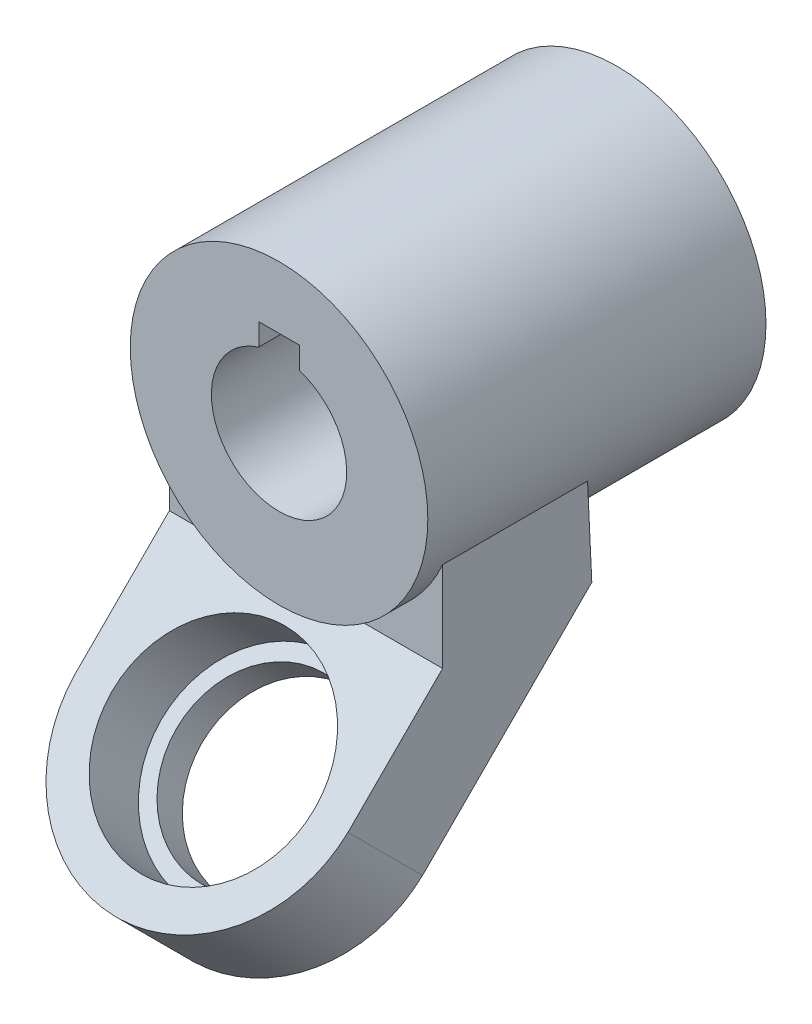
ISO-10303-21;
HEADER;
FILE_DESCRIPTION(('STEP AP214'),'2;1');
FILE_NAME('part.step','',(''),(''),'','','');
FILE_SCHEMA(('AUTOMOTIVE_DESIGN { 1 0 10303 214 1 1 1 1 }'));
ENDSEC;
DATA;
#1=APPLICATION_CONTEXT('core data for automotive mechanical design processes');
#2=APPLICATION_PROTOCOL_DEFINITION('international standard','automotive_design',2000,#1);
#3=PRODUCT_CONTEXT('',#1,'mechanical');
#4=PRODUCT('Part','Part','',(#3));
#5=PRODUCT_RELATED_PRODUCT_CATEGORY('part','',(#4));
#6=PRODUCT_DEFINITION_FORMATION('','',#4);
#7=PRODUCT_DEFINITION_CONTEXT('part definition',#1,'design');
#8=PRODUCT_DEFINITION('design','',#6,#7);
#9=PRODUCT_DEFINITION_SHAPE('','',#8);
#10=(LENGTH_UNIT() NAMED_UNIT(*) SI_UNIT(.MILLI.,.METRE.));
#11=(NAMED_UNIT(*) PLANE_ANGLE_UNIT() SI_UNIT($,.RADIAN.));
#12=(NAMED_UNIT(*) SI_UNIT($,.STERADIAN.) SOLID_ANGLE_UNIT());
#13=UNCERTAINTY_MEASURE_WITH_UNIT(LENGTH_MEASURE(1.E-05),#10,'distance_accuracy_value','');
#14=(GEOMETRIC_REPRESENTATION_CONTEXT(3) GLOBAL_UNCERTAINTY_ASSIGNED_CONTEXT((#13)) GLOBAL_UNIT_ASSIGNED_CONTEXT((#10,
#11,#12)) REPRESENTATION_CONTEXT('',''));
#15=CARTESIAN_POINT('',(0.,0.,0.));
#16=DIRECTION('',(0.,0.,1.));
#17=DIRECTION('',(1.,0.,0.));
#18=AXIS2_PLACEMENT_3D('',#15,#16,#17);
#19=CARTESIAN_POINT('',(-20.2,-49.9834703247907,49.0000000000002));
#20=DIRECTION('',(0.,0.707106781186549,0.707106781186546));
#21=DIRECTION('',(0.,-0.707106781186546,0.707106781186549));
#22=AXIS2_PLACEMENT_3D('',#19,#20,#21);
#23=PLANE('',#22);
#24=CARTESIAN_POINT('',(0.,-35.6999133448224,34.7164430200319));
#25=DIRECTION('',(0.,0.707106781186549,0.707106781186546));
#26=DIRECTION('',(0.,-0.707106781186546,0.707106781186549));
#27=AXIS2_PLACEMENT_3D('',#24,#25,#26);
#28=CIRCLE('',#27,15.);
#29=CARTESIAN_POINT('',(0.,-46.3065150626206,45.3230447378301));
#30=VERTEX_POINT('',#29);
#31=EDGE_CURVE('E283',#30,#30,#28,.T.);
#32=ORIENTED_EDGE('',*,*,#31,.F.);
#33=EDGE_LOOP('',(#32));
#34=FACE_BOUND('',#33,.T.);
#35=CARTESIAN_POINT('',(0.,-35.6999133448224,34.7164430200319));
#36=DIRECTION('',(0.,0.707106781186549,0.707106781186547));
#37=DIRECTION('',(0.,-0.707106781186547,0.707106781186549));
#38=AXIS2_PLACEMENT_3D('',#35,#36,#37);
#39=CIRCLE('',#38,20.2042154004164);
#40=CARTESIAN_POINT('',(20.2,-35.9917351623954,35.0082648376048));
#41=VERTEX_POINT('',#40);
#42=CARTESIAN_POINT('',(0.412698372207648,-49.9834703247907,49.0000000000002));
#43=VERTEX_POINT('',#42);
#44=EDGE_CURVE('E140',#41,#43,#39,.F.);
#45=ORIENTED_EDGE('',*,*,#44,.F.);
#46=DIRECTION('',(0.,-0.707106781186546,0.707106781186549));
#47=VECTOR('',#46,1.);
#48=CARTESIAN_POINT('',(20.2,-49.9834703247907,49.0000000000002));
#49=LINE('',#48,#47);
#50=CARTESIAN_POINT('',(20.2,-22.,21.0165296752094));
#51=VERTEX_POINT('',#50);
#52=EDGE_CURVE('E150',#51,#41,#49,.T.);
#53=ORIENTED_EDGE('',*,*,#52,.F.);
#54=DIRECTION('',(1.,0.,0.));
#55=VECTOR('',#54,1.);
#56=CARTESIAN_POINT('',(-20.2,-22.,21.0165296752094));
#57=LINE('',#56,#55);
#58=CARTESIAN_POINT('',(0.,-22.,21.0165296752094));
#59=VERTEX_POINT('',#58);
#60=EDGE_CURVE('E185',#59,#51,#57,.T.);
#61=ORIENTED_EDGE('',*,*,#60,.F.);
#62=CARTESIAN_POINT('',(-20.2,-22.,21.0165296752094));
#63=VERTEX_POINT('',#62);
#64=EDGE_CURVE('E198',#63,#59,#57,.T.);
#65=ORIENTED_EDGE('',*,*,#64,.F.);
#66=DIRECTION('',(0.,-0.707106781186546,0.707106781186549));
#67=VECTOR('',#66,1.);
#68=CARTESIAN_POINT('',(-20.2,-49.9834703247907,49.0000000000002));
#69=LINE('',#68,#67);
#70=CARTESIAN_POINT('',(-20.2,-35.991735162395,35.0082648376044));
#71=VERTEX_POINT('',#70);
#72=EDGE_CURVE('E178',#63,#71,#69,.T.);
#73=ORIENTED_EDGE('',*,*,#72,.T.);
#74=CARTESIAN_POINT('',(0.,-35.6999133448224,34.7164430200319));
#75=DIRECTION('',(0.,0.707106781186549,0.707106781186547));
#76=DIRECTION('',(0.,-0.707106781186547,0.707106781186549));
#77=AXIS2_PLACEMENT_3D('',#74,#75,#76);
#78=CIRCLE('',#77,20.2042154004164);
#79=CARTESIAN_POINT('',(-0.412698372207636,-49.9834703247907,49.0000000000002));
#80=VERTEX_POINT('',#79);
#81=EDGE_CURVE('E271',#80,#71,#78,.F.);
#82=ORIENTED_EDGE('',*,*,#81,.F.);
#83=DIRECTION('',(1.,0.,0.));
#84=VECTOR('',#83,1.);
#85=CARTESIAN_POINT('',(-20.2,-49.9834703247907,49.0000000000002));
#86=LINE('',#85,#84);
#87=EDGE_CURVE('E153',#80,#43,#86,.T.);
#88=ORIENTED_EDGE('',*,*,#87,.T.);
#89=EDGE_LOOP('',(#45,#53,#61,#65,#73,#82,#88));
#90=FACE_BOUND('',#89,.T.);
#91=ADVANCED_FACE('F44',(#34,#90),#23,.T.);
#92=CARTESIAN_POINT('',(-20.2,-22.,-1.0452018978109));
#93=DIRECTION('',(0.,-0.707106781186549,-0.707106781186547));
#94=DIRECTION('',(0.,0.707106781186547,-0.707106781186549));
#95=AXIS2_PLACEMENT_3D('',#92,#93,#94);
#96=PLANE('',#95);
#97=CARTESIAN_POINT('',(0.,-46.7307791313326,23.6855772335218));
#98=DIRECTION('',(0.,-0.707106781186549,-0.707106781186547));
#99=DIRECTION('',(0.,0.707106781186547,-0.707106781186549));
#100=AXIS2_PLACEMENT_3D('',#97,#98,#99);
#101=CIRCLE('',#100,12.75);
#102=CARTESIAN_POINT('',(0.,-37.7151676712041,14.6699657733933));
#103=VERTEX_POINT('',#102);
#104=EDGE_CURVE('E257',#103,#103,#101,.T.);
#105=ORIENTED_EDGE('',*,*,#104,.F.);
#106=EDGE_LOOP('',(#105));
#107=FACE_BOUND('',#106,.T.);
#108=CARTESIAN_POINT('',(0.,-46.7307791313326,23.6855772335218));
#109=DIRECTION('',(0.,-0.707106781186549,-0.707106781186547));
#110=DIRECTION('',(0.,0.707106781186547,-0.707106781186549));
#111=AXIS2_PLACEMENT_3D('',#108,#109,#110);
#112=CIRCLE('',#111,20.2042154004164);
#113=CARTESIAN_POINT('',(0.412698372207648,-61.0143361113008,37.96913421349));
#114=VERTEX_POINT('',#113);
#115=CARTESIAN_POINT('',(20.2,-47.0226009489055,23.9773990510947));
#116=VERTEX_POINT('',#115);
#117=EDGE_CURVE('E11',#114,#116,#112,.F.);
#118=ORIENTED_EDGE('',*,*,#117,.F.);
#119=DIRECTION('',(1.,0.,0.));
#120=VECTOR('',#119,1.);
#121=CARTESIAN_POINT('',(-20.2,-61.0143361113008,37.96913421349));
#122=LINE('',#121,#120);
#123=CARTESIAN_POINT('',(-0.412698372207636,-61.0143361113008,37.96913421349));
#124=VERTEX_POINT('',#123);
#125=EDGE_CURVE('E192',#124,#114,#122,.T.);
#126=ORIENTED_EDGE('',*,*,#125,.F.);
#127=CARTESIAN_POINT('',(0.,-46.7307791313326,23.6855772335218));
#128=DIRECTION('',(0.,-0.707106781186549,-0.707106781186547));
#129=DIRECTION('',(0.,0.707106781186547,-0.707106781186549));
#130=AXIS2_PLACEMENT_3D('',#127,#128,#129);
#131=CIRCLE('',#130,20.2042154004164);
#132=CARTESIAN_POINT('',(-20.2,-47.0226009489051,23.9773990510943));
#133=VERTEX_POINT('',#132);
#134=EDGE_CURVE('E53',#133,#124,#131,.F.);
#135=ORIENTED_EDGE('',*,*,#134,.F.);
#136=DIRECTION('',(0.,0.707106781186546,-0.707106781186548));
#137=VECTOR('',#136,1.);
#138=CARTESIAN_POINT('',(-20.2,-22.,-1.0452018978109));
#139=LINE('',#138,#137);
#140=CARTESIAN_POINT('',(-20.2,-22.,-1.0452018978109));
#141=VERTEX_POINT('',#140);
#142=EDGE_CURVE('E182',#133,#141,#139,.T.);
#143=ORIENTED_EDGE('',*,*,#142,.T.);
#144=DIRECTION('',(1.,0.,0.));
#145=VECTOR('',#144,1.);
#146=CARTESIAN_POINT('',(-20.2,-22.,-1.0452018978109));
#147=LINE('',#146,#145);
#148=CARTESIAN_POINT('',(0.,-22.,-1.0452018978109));
#149=VERTEX_POINT('',#148);
#150=EDGE_CURVE('E186',#141,#149,#147,.T.);
#151=ORIENTED_EDGE('',*,*,#150,.T.);
#152=CARTESIAN_POINT('',(20.2,-22.,-1.0452018978109));
#153=VERTEX_POINT('',#152);
#154=EDGE_CURVE('E191',#149,#153,#147,.T.);
#155=ORIENTED_EDGE('',*,*,#154,.T.);
#156=DIRECTION('',(0.,0.707106781186546,-0.707106781186548));
#157=VECTOR('',#156,1.);
#158=CARTESIAN_POINT('',(20.2,-22.,-1.0452018978109));
#159=LINE('',#158,#157);
#160=EDGE_CURVE('E162',#116,#153,#159,.T.);
#161=ORIENTED_EDGE('',*,*,#160,.F.);
#162=EDGE_LOOP('',(#118,#126,#135,#143,#151,#155,#161));
#163=FACE_BOUND('',#162,.T.);
#164=ADVANCED_FACE('F273',(#107,#163),#96,.T.);
#165=CARTESIAN_POINT('',(0.,0.,-25.));
#166=DIRECTION('',(0.,0.,1.));
#167=DIRECTION('',(1.,0.,0.));
#168=AXIS2_PLACEMENT_3D('',#165,#166,#167);
#169=CYLINDRICAL_SURFACE('',#168,10.);
#170=CARTESIAN_POINT('',(0.,0.,-23.));
#171=DIRECTION('',(0.,0.,-1.));
#172=DIRECTION('',(-1.,0.,0.));
#173=AXIS2_PLACEMENT_3D('',#170,#171,#172);
#174=CIRCLE('',#173,10.);
#175=CARTESIAN_POINT('',(-3.,9.53939201416946,-23.));
#176=VERTEX_POINT('',#175);
#177=CARTESIAN_POINT('',(3.,9.53939201416946,-23.));
#178=VERTEX_POINT('',#177);
#179=EDGE_CURVE('E258',#176,#178,#174,.F.);
#180=ORIENTED_EDGE('',*,*,#179,.F.);
#181=DIRECTION('',(0.,0.,1.));
#182=VECTOR('',#181,1.);
#183=CARTESIAN_POINT('',(-3.,9.53939201416946,-25.));
#184=LINE('',#183,#182);
#185=CARTESIAN_POINT('',(-3.,9.53939201416946,25.));
#186=VERTEX_POINT('',#185);
#187=EDGE_CURVE('E225',#176,#186,#184,.T.);
#188=ORIENTED_EDGE('',*,*,#187,.T.);
#189=CARTESIAN_POINT('',(0.,0.,25.));
#190=DIRECTION('',(0.,0.,1.));
#191=DIRECTION('',(1.,0.,0.));
#192=AXIS2_PLACEMENT_3D('',#189,#190,#191);
#193=CIRCLE('',#192,10.);
#194=CARTESIAN_POINT('',(3.,9.53939201416946,25.));
#195=VERTEX_POINT('',#194);
#196=EDGE_CURVE('E205',#186,#195,#193,.T.);
#197=ORIENTED_EDGE('',*,*,#196,.T.);
#198=DIRECTION('',(0.,0.,1.));
#199=VECTOR('',#198,1.);
#200=CARTESIAN_POINT('',(3.,9.53939201416946,-25.));
#201=LINE('',#200,#199);
#202=EDGE_CURVE('E226',#178,#195,#201,.T.);
#203=ORIENTED_EDGE('',*,*,#202,.F.);
#204=EDGE_LOOP('',(#180,#188,#197,#203));
#205=FACE_BOUND('',#204,.T.);
#206=ADVANCED_FACE('F365',(#205),#169,.F.);
#207=CARTESIAN_POINT('',(3.,0.,-25.));
#208=DIRECTION('',(-1.,0.,0.));
#209=DIRECTION('',(0.,-1.,0.));
#210=AXIS2_PLACEMENT_3D('',#207,#208,#209);
#211=PLANE('',#210);
#212=DIRECTION('',(0.,0.,1.));
#213=VECTOR('',#212,1.);
#214=CARTESIAN_POINT('',(3.,12.8,-25.));
#215=LINE('',#214,#213);
#216=CARTESIAN_POINT('',(3.,12.8,-23.));
#217=VERTEX_POINT('',#216);
#218=CARTESIAN_POINT('',(3.,12.8,25.));
#219=VERTEX_POINT('',#218);
#220=EDGE_CURVE('E230',#217,#219,#215,.T.);
#221=ORIENTED_EDGE('',*,*,#220,.F.);
#222=DIRECTION('',(0.,-1.,0.));
#223=VECTOR('',#222,1.);
#224=CARTESIAN_POINT('',(3.,0.,-23.));
#225=LINE('',#224,#223);
#226=EDGE_CURVE('E294',#217,#178,#225,.T.);
#227=ORIENTED_EDGE('',*,*,#226,.T.);
#228=ORIENTED_EDGE('',*,*,#202,.T.);
#229=DIRECTION('',(0.,-1.,0.));
#230=VECTOR('',#229,1.);
#231=CARTESIAN_POINT('',(3.,0.,25.));
#232=LINE('',#231,#230);
#233=EDGE_CURVE('E217',#219,#195,#232,.T.);
#234=ORIENTED_EDGE('',*,*,#233,.F.);
#235=EDGE_LOOP('',(#221,#227,#228,#234));
#236=FACE_BOUND('',#235,.T.);
#237=ADVANCED_FACE('F363',(#236),#211,.T.);
#238=CARTESIAN_POINT('',(0.,12.8,-25.));
#239=DIRECTION('',(0.,-1.,0.));
#240=DIRECTION('',(1.,0.,0.));
#241=AXIS2_PLACEMENT_3D('',#238,#239,#240);
#242=PLANE('',#241);
#243=DIRECTION('',(0.,0.,1.));
#244=VECTOR('',#243,1.);
#245=CARTESIAN_POINT('',(-3.,12.8,-25.));
#246=LINE('',#245,#244);
#247=CARTESIAN_POINT('',(-3.,12.8,-23.));
#248=VERTEX_POINT('',#247);
#249=CARTESIAN_POINT('',(-3.,12.8,25.));
#250=VERTEX_POINT('',#249);
#251=EDGE_CURVE('E233',#248,#250,#246,.T.);
#252=ORIENTED_EDGE('',*,*,#251,.F.);
#253=DIRECTION('',(1.,0.,0.));
#254=VECTOR('',#253,1.);
#255=CARTESIAN_POINT('',(0.,12.8,-23.));
#256=LINE('',#255,#254);
#257=EDGE_CURVE('E298',#248,#217,#256,.T.);
#258=ORIENTED_EDGE('',*,*,#257,.T.);
#259=ORIENTED_EDGE('',*,*,#220,.T.);
#260=DIRECTION('',(1.,0.,0.));
#261=VECTOR('',#260,1.);
#262=CARTESIAN_POINT('',(0.,12.8,25.));
#263=LINE('',#262,#261);
#264=EDGE_CURVE('E213',#250,#219,#263,.T.);
#265=ORIENTED_EDGE('',*,*,#264,.F.);
#266=EDGE_LOOP('',(#252,#258,#259,#265));
#267=FACE_BOUND('',#266,.T.);
#268=ADVANCED_FACE('F360',(#267),#242,.T.);
#269=CARTESIAN_POINT('',(-3.,0.,-25.));
#270=DIRECTION('',(-1.,0.,0.));
#271=DIRECTION('',(0.,-1.,0.));
#272=AXIS2_PLACEMENT_3D('',#269,#270,#271);
#273=PLANE('',#272);
#274=DIRECTION('',(0.,-1.,0.));
#275=VECTOR('',#274,1.);
#276=CARTESIAN_POINT('',(-3.,0.,-23.));
#277=LINE('',#276,#275);
#278=EDGE_CURVE('E259',#248,#176,#277,.T.);
#279=ORIENTED_EDGE('',*,*,#278,.F.);
#280=ORIENTED_EDGE('',*,*,#251,.T.);
#281=DIRECTION('',(0.,-1.,0.));
#282=VECTOR('',#281,1.);
#283=CARTESIAN_POINT('',(-3.,0.,25.));
#284=LINE('',#283,#282);
#285=EDGE_CURVE('E209',#250,#186,#284,.T.);
#286=ORIENTED_EDGE('',*,*,#285,.T.);
#287=ORIENTED_EDGE('',*,*,#187,.F.);
#288=EDGE_LOOP('',(#279,#280,#286,#287));
#289=FACE_BOUND('',#288,.T.);
#290=ADVANCED_FACE('F340',(#289),#273,.F.);
#291=CARTESIAN_POINT('',(0.,0.,-25.));
#292=DIRECTION('',(0.,0.,1.));
#293=DIRECTION('',(1.,0.,0.));
#294=AXIS2_PLACEMENT_3D('',#291,#292,#293);
#295=CYLINDRICAL_SURFACE('',#294,22.);
#296=CARTESIAN_POINT('',(0.,0.,21.0165296752094));
#297=DIRECTION('',(0.,0.,1.));
#298=DIRECTION('',(1.,0.,0.));
#299=AXIS2_PLACEMENT_3D('',#296,#297,#298);
#300=CIRCLE('',#299,22.);
#301=CARTESIAN_POINT('',(-20.2,-8.71550342780038,21.0165296752094));
#302=VERTEX_POINT('',#301);
#303=EDGE_CURVE('E245',#59,#302,#300,.F.);
#304=ORIENTED_EDGE('',*,*,#303,.F.);
#305=CARTESIAN_POINT('',(20.2,-8.71550342780038,21.0165296752094));
#306=VERTEX_POINT('',#305);
#307=EDGE_CURVE('E240',#306,#59,#300,.F.);
#308=ORIENTED_EDGE('',*,*,#307,.F.);
#309=DIRECTION('',(0.,0.,1.));
#310=VECTOR('',#309,1.);
#311=CARTESIAN_POINT('',(20.2,-8.71550342780038,-25.));
#312=LINE('',#311,#310);
#313=CARTESIAN_POINT('',(20.2,-8.71550342780038,-0.414066396505156));
#314=VERTEX_POINT('',#313);
#315=EDGE_CURVE('E229',#314,#306,#312,.T.);
#316=ORIENTED_EDGE('',*,*,#315,.F.);
#317=CARTESIAN_POINT('',(0.,0.,0.));
#318=DIRECTION('',(0.,0.0474556507654259,-0.998873345930519));
#319=DIRECTION('',(0.,0.998873345930519,0.0474556507654259));
#320=AXIS2_PLACEMENT_3D('',#317,#318,#319);
#321=ELLIPSE('',#320,22.0248143467133,22.);
#322=EDGE_CURVE('E244',#149,#314,#321,.F.);
#323=ORIENTED_EDGE('',*,*,#322,.F.);
#324=CARTESIAN_POINT('',(-20.2,-8.71550342780037,-0.414066396505155));
#325=VERTEX_POINT('',#324);
#326=EDGE_CURVE('E249',#325,#149,#321,.F.);
#327=ORIENTED_EDGE('',*,*,#326,.F.);
#328=DIRECTION('',(0.,0.,1.));
#329=VECTOR('',#328,1.);
#330=CARTESIAN_POINT('',(-20.2,-8.71550342780038,-25.));
#331=LINE('',#330,#329);
#332=EDGE_CURVE('E250',#325,#302,#331,.T.);
#333=ORIENTED_EDGE('',*,*,#332,.T.);
#334=EDGE_LOOP('',(#304,#308,#316,#323,#327,#333));
#335=FACE_BOUND('',#334,.T.);
#336=CARTESIAN_POINT('',(0.,0.,-25.));
#337=DIRECTION('',(0.,0.,1.));
#338=DIRECTION('',(1.,0.,0.));
#339=AXIS2_PLACEMENT_3D('',#336,#337,#338);
#340=CIRCLE('',#339,22.);
#341=CARTESIAN_POINT('',(22.,0.,-25.));
#342=VERTEX_POINT('',#341);
#343=EDGE_CURVE('E221',#342,#342,#340,.T.);
#344=ORIENTED_EDGE('',*,*,#343,.T.);
#345=EDGE_LOOP('',(#344));
#346=FACE_BOUND('',#345,.T.);
#347=CARTESIAN_POINT('',(0.,0.,25.));
#348=DIRECTION('',(0.,0.,1.));
#349=DIRECTION('',(1.,0.,0.));
#350=AXIS2_PLACEMENT_3D('',#347,#348,#349);
#351=CIRCLE('',#350,22.);
#352=CARTESIAN_POINT('',(22.,0.,25.));
#353=VERTEX_POINT('',#352);
#354=EDGE_CURVE('E190',#353,#353,#351,.T.);
#355=ORIENTED_EDGE('',*,*,#354,.F.);
#356=EDGE_LOOP('',(#355));
#357=FACE_BOUND('',#356,.T.);
#358=ADVANCED_FACE('F46',(#335,#346,#357),#295,.T.);
#359=CARTESIAN_POINT('',(0.,0.,-25.));
#360=DIRECTION('',(0.,0.,1.));
#361=DIRECTION('',(1.,0.,0.));
#362=AXIS2_PLACEMENT_3D('',#359,#360,#361);
#363=PLANE('',#362);
#364=CARTESIAN_POINT('',(0.,0.,-25.));
#365=DIRECTION('',(0.,0.,-1.));
#366=DIRECTION('',(-1.,0.,0.));
#367=AXIS2_PLACEMENT_3D('',#364,#365,#366);
#368=CIRCLE('',#367,18.);
#369=CARTESIAN_POINT('',(-18.,0.,-25.));
#370=VERTEX_POINT('',#369);
#371=EDGE_CURVE('E303',#370,#370,#368,.T.);
#372=ORIENTED_EDGE('',*,*,#371,.F.);
#373=EDGE_LOOP('',(#372));
#374=FACE_BOUND('',#373,.T.);
#375=ORIENTED_EDGE('',*,*,#343,.F.);
#376=EDGE_LOOP('',(#375));
#377=FACE_BOUND('',#376,.T.);
#378=ADVANCED_FACE('F339',(#374,#377),#363,.F.);
#379=CARTESIAN_POINT('',(0.,0.,25.));
#380=DIRECTION('',(0.,0.,1.));
#381=DIRECTION('',(1.,0.,0.));
#382=AXIS2_PLACEMENT_3D('',#379,#380,#381);
#383=PLANE('',#382);
#384=ORIENTED_EDGE('',*,*,#354,.T.);
#385=EDGE_LOOP('',(#384));
#386=FACE_BOUND('',#385,.T.);
#387=ORIENTED_EDGE('',*,*,#196,.F.);
#388=ORIENTED_EDGE('',*,*,#285,.F.);
#389=ORIENTED_EDGE('',*,*,#264,.T.);
#390=ORIENTED_EDGE('',*,*,#233,.T.);
#391=EDGE_LOOP('',(#387,#388,#389,#390));
#392=FACE_BOUND('',#391,.T.);
#393=ADVANCED_FACE('F345',(#386,#392),#383,.T.);
#394=CARTESIAN_POINT('',(20.2,0.,0.));
#395=DIRECTION('',(1.,0.,0.));
#396=DIRECTION('',(0.,0.,-1.));
#397=AXIS2_PLACEMENT_3D('',#394,#395,#396);
#398=PLANE('',#397);
#399=DIRECTION('',(0.,0.707106781186549,0.707106781186546));
#400=VECTOR('',#399,1.);
#401=CARTESIAN_POINT('',(20.2,-78.5071680556505,-7.50716805565025));
#402=LINE('',#401,#400);
#403=EDGE_CURVE('E137',#116,#41,#402,.T.);
#404=ORIENTED_EDGE('',*,*,#403,.F.);
#405=ORIENTED_EDGE('',*,*,#160,.T.);
#406=DIRECTION('',(0.,0.998873345930519,0.0474556507654259));
#407=VECTOR('',#406,1.);
#408=CARTESIAN_POINT('',(20.2,0.,0.));
#409=LINE('',#408,#407);
#410=EDGE_CURVE('E168',#153,#314,#409,.T.);
#411=ORIENTED_EDGE('',*,*,#410,.T.);
#412=ORIENTED_EDGE('',*,*,#315,.T.);
#413=DIRECTION('',(0.,-1.,0.));
#414=VECTOR('',#413,1.);
#415=CARTESIAN_POINT('',(20.2,-22.,21.0165296752094));
#416=LINE('',#415,#414);
#417=EDGE_CURVE('E160',#306,#51,#416,.T.);
#418=ORIENTED_EDGE('',*,*,#417,.T.);
#419=ORIENTED_EDGE('',*,*,#52,.T.);
#420=EDGE_LOOP('',(#404,#405,#411,#412,#418,#419));
#421=FACE_BOUND('',#420,.T.);
#422=ADVANCED_FACE('F157',(#421),#398,.T.);
#423=CARTESIAN_POINT('',(-20.2,0.,0.));
#424=DIRECTION('',(1.,0.,0.));
#425=DIRECTION('',(0.,0.,-1.));
#426=AXIS2_PLACEMENT_3D('',#423,#424,#425);
#427=PLANE('',#426);
#428=ORIENTED_EDGE('',*,*,#142,.F.);
#429=DIRECTION('',(0.,0.707106781186549,0.707106781186546));
#430=VECTOR('',#429,1.);
#431=CARTESIAN_POINT('',(-20.2,-78.5071680556501,-7.50716805565063));
#432=LINE('',#431,#430);
#433=EDGE_CURVE('E60',#133,#71,#432,.T.);
#434=ORIENTED_EDGE('',*,*,#433,.T.);
#435=ORIENTED_EDGE('',*,*,#72,.F.);
#436=DIRECTION('',(0.,-1.,0.));
#437=VECTOR('',#436,1.);
#438=CARTESIAN_POINT('',(-20.2,-22.,21.0165296752094));
#439=LINE('',#438,#437);
#440=EDGE_CURVE('E175',#302,#63,#439,.T.);
#441=ORIENTED_EDGE('',*,*,#440,.F.);
#442=ORIENTED_EDGE('',*,*,#332,.F.);
#443=DIRECTION('',(0.,0.998873345930519,0.0474556507654259));
#444=VECTOR('',#443,1.);
#445=CARTESIAN_POINT('',(-20.2,0.,0.));
#446=LINE('',#445,#444);
#447=EDGE_CURVE('E166',#141,#325,#446,.T.);
#448=ORIENTED_EDGE('',*,*,#447,.F.);
#449=EDGE_LOOP('',(#428,#434,#435,#441,#442,#448));
#450=FACE_BOUND('',#449,.T.);
#451=ADVANCED_FACE('F317',(#450),#427,.F.);
#452=CARTESIAN_POINT('',(-20.2,-22.,21.0165296752094));
#453=DIRECTION('',(0.,0.,1.));
#454=DIRECTION('',(1.,0.,0.));
#455=AXIS2_PLACEMENT_3D('',#452,#453,#454);
#456=PLANE('',#455);
#457=ORIENTED_EDGE('',*,*,#64,.T.);
#458=ORIENTED_EDGE('',*,*,#303,.T.);
#459=ORIENTED_EDGE('',*,*,#440,.T.);
#460=EDGE_LOOP('',(#457,#458,#459));
#461=FACE_BOUND('',#460,.T.);
#462=ADVANCED_FACE('F323',(#461),#456,.T.);
#463=CARTESIAN_POINT('',(-20.2,-61.0143361113008,37.96913421349));
#464=DIRECTION('',(0.,-0.707106781186546,0.707106781186549));
#465=DIRECTION('',(0.,-0.707106781186549,-0.707106781186546));
#466=AXIS2_PLACEMENT_3D('',#463,#464,#465);
#467=PLANE('',#466);
#468=DIRECTION('',(0.,0.707106781186549,0.707106781186546));
#469=VECTOR('',#468,1.);
#470=CARTESIAN_POINT('',(0.412698372207648,-92.4989032180459,6.48456710674512));
#471=LINE('',#470,#469);
#472=EDGE_CURVE('E67',#114,#43,#471,.T.);
#473=ORIENTED_EDGE('',*,*,#472,.T.);
#474=ORIENTED_EDGE('',*,*,#87,.F.);
#475=DIRECTION('',(0.,0.707106781186549,0.707106781186546));
#476=VECTOR('',#475,1.);
#477=CARTESIAN_POINT('',(-0.412698372207636,-92.4989032180459,6.48456710674512));
#478=LINE('',#477,#476);
#479=EDGE_CURVE('E264',#124,#80,#478,.T.);
#480=ORIENTED_EDGE('',*,*,#479,.F.);
#481=ORIENTED_EDGE('',*,*,#125,.T.);
#482=EDGE_LOOP('',(#473,#474,#480,#481));
#483=FACE_BOUND('',#482,.T.);
#484=ADVANCED_FACE('F269',(#483),#467,.T.);
#485=CARTESIAN_POINT('',(-20.2,0.,0.));
#486=DIRECTION('',(0.,0.0474556507654259,-0.998873345930519));
#487=DIRECTION('',(0.,0.998873345930519,0.0474556507654259));
#488=AXIS2_PLACEMENT_3D('',#485,#486,#487);
#489=PLANE('',#488);
#490=ORIENTED_EDGE('',*,*,#154,.F.);
#491=ORIENTED_EDGE('',*,*,#322,.T.);
#492=ORIENTED_EDGE('',*,*,#410,.F.);
#493=EDGE_LOOP('',(#490,#491,#492));
#494=FACE_BOUND('',#493,.T.);
#495=ADVANCED_FACE('F331',(#494),#489,.T.);
#496=ORIENTED_EDGE('',*,*,#417,.F.);
#497=ORIENTED_EDGE('',*,*,#307,.T.);
#498=ORIENTED_EDGE('',*,*,#60,.T.);
#499=EDGE_LOOP('',(#496,#497,#498));
#500=FACE_BOUND('',#499,.T.);
#501=ADVANCED_FACE('F335',(#500),#456,.T.);
#502=ORIENTED_EDGE('',*,*,#447,.T.);
#503=ORIENTED_EDGE('',*,*,#326,.T.);
#504=ORIENTED_EDGE('',*,*,#150,.F.);
#505=EDGE_LOOP('',(#502,#503,#504));
#506=FACE_BOUND('',#505,.T.);
#507=ADVANCED_FACE('F329',(#506),#489,.T.);
#508=CARTESIAN_POINT('',(0.,-42.9831131910439,27.4332431738104));
#509=DIRECTION('',(0.,0.707106781186549,0.707106781186546));
#510=DIRECTION('',(0.,-0.707106781186546,0.707106781186549));
#511=AXIS2_PLACEMENT_3D('',#508,#509,#510);
#512=CYLINDRICAL_SURFACE('',#511,15.);
#513=CARTESIAN_POINT('',(0.,-42.9831131910439,27.4332431738104));
#514=DIRECTION('',(0.,0.707106781186549,0.707106781186546));
#515=DIRECTION('',(0.,-0.707106781186546,0.707106781186549));
#516=AXIS2_PLACEMENT_3D('',#513,#514,#515);
#517=CIRCLE('',#516,15.);
#518=CARTESIAN_POINT('',(0.,-53.5897149088421,38.0398448916087));
#519=VERTEX_POINT('',#518);
#520=EDGE_CURVE('E280',#519,#519,#517,.T.);
#521=ORIENTED_EDGE('',*,*,#520,.F.);
#522=EDGE_LOOP('',(#521));
#523=FACE_BOUND('',#522,.T.);
#524=ORIENTED_EDGE('',*,*,#31,.T.);
#525=EDGE_LOOP('',(#524));
#526=FACE_BOUND('',#525,.T.);
#527=ADVANCED_FACE('F473',(#523,#526),#512,.F.);
#528=CARTESIAN_POINT('',(0.,-42.9831131910439,27.4332431738104));
#529=DIRECTION('',(0.,0.707106781186549,0.707106781186546));
#530=DIRECTION('',(0.,-0.707106781186546,0.707106781186549));
#531=AXIS2_PLACEMENT_3D('',#528,#529,#530);
#532=PLANE('',#531);
#533=CARTESIAN_POINT('',(0.,-42.9831131910439,27.4332431738104));
#534=DIRECTION('',(0.,0.707106781186549,0.707106781186546));
#535=DIRECTION('',(0.,-0.707106781186546,0.707106781186549));
#536=AXIS2_PLACEMENT_3D('',#533,#534,#535);
#537=CIRCLE('',#536,12.75);
#538=CARTESIAN_POINT('',(0.,-51.9987246511723,36.4488546339389));
#539=VERTEX_POINT('',#538);
#540=EDGE_CURVE('E253',#539,#539,#537,.T.);
#541=ORIENTED_EDGE('',*,*,#540,.F.);
#542=EDGE_LOOP('',(#541));
#543=FACE_BOUND('',#542,.T.);
#544=ORIENTED_EDGE('',*,*,#520,.T.);
#545=EDGE_LOOP('',(#544));
#546=FACE_BOUND('',#545,.T.);
#547=ADVANCED_FACE('F379',(#543,#546),#532,.T.);
#548=CARTESIAN_POINT('',(0.,-78.2153462380776,-7.79898987322317));
#549=DIRECTION('',(0.,0.707106781186549,0.707106781186546));
#550=DIRECTION('',(0.,-0.707106781186546,0.707106781186549));
#551=AXIS2_PLACEMENT_3D('',#548,#549,#550);
#552=CYLINDRICAL_SURFACE('',#551,12.75);
#553=ORIENTED_EDGE('',*,*,#104,.T.);
#554=EDGE_LOOP('',(#553));
#555=FACE_BOUND('',#554,.T.);
#556=ORIENTED_EDGE('',*,*,#540,.T.);
#557=EDGE_LOOP('',(#556));
#558=FACE_BOUND('',#557,.T.);
#559=ADVANCED_FACE('F370',(#555,#558),#552,.F.);
#560=CARTESIAN_POINT('',(0.,0.,-23.));
#561=DIRECTION('',(0.,0.,-1.));
#562=DIRECTION('',(-1.,0.,0.));
#563=AXIS2_PLACEMENT_3D('',#560,#561,#562);
#564=PLANE('',#563);
#565=CARTESIAN_POINT('',(0.,0.,-23.));
#566=DIRECTION('',(0.,0.,-1.));
#567=DIRECTION('',(-1.,0.,0.));
#568=AXIS2_PLACEMENT_3D('',#565,#566,#567);
#569=CIRCLE('',#568,18.);
#570=CARTESIAN_POINT('',(-18.,0.,-23.));
#571=VERTEX_POINT('',#570);
#572=EDGE_CURVE('E302',#571,#571,#569,.T.);
#573=ORIENTED_EDGE('',*,*,#572,.T.);
#574=EDGE_LOOP('',(#573));
#575=FACE_BOUND('',#574,.T.);
#576=ORIENTED_EDGE('',*,*,#179,.T.);
#577=ORIENTED_EDGE('',*,*,#226,.F.);
#578=ORIENTED_EDGE('',*,*,#257,.F.);
#579=ORIENTED_EDGE('',*,*,#278,.T.);
#580=EDGE_LOOP('',(#576,#577,#578,#579));
#581=FACE_BOUND('',#580,.T.);
#582=ADVANCED_FACE('F367',(#575,#581),#564,.T.);
#583=CARTESIAN_POINT('',(0.,0.,-23.));
#584=DIRECTION('',(0.,0.,-1.));
#585=DIRECTION('',(-1.,0.,0.));
#586=AXIS2_PLACEMENT_3D('',#583,#584,#585);
#587=CYLINDRICAL_SURFACE('',#586,18.);
#588=ORIENTED_EDGE('',*,*,#572,.F.);
#589=EDGE_LOOP('',(#588));
#590=FACE_BOUND('',#589,.T.);
#591=ORIENTED_EDGE('',*,*,#371,.T.);
#592=EDGE_LOOP('',(#591));
#593=FACE_BOUND('',#592,.T.);
#594=ADVANCED_FACE('F369',(#590,#593),#587,.F.);
#595=CARTESIAN_POINT('',(0.,-78.2153462380776,-7.79898987322317));
#596=DIRECTION('',(0.,0.707106781186549,0.707106781186546));
#597=DIRECTION('',(0.,-0.707106781186546,0.707106781186549));
#598=AXIS2_PLACEMENT_3D('',#595,#596,#597);
#599=CYLINDRICAL_SURFACE('',#598,20.2042154004164);
#600=ORIENTED_EDGE('',*,*,#134,.T.);
#601=ORIENTED_EDGE('',*,*,#479,.T.);
#602=ORIENTED_EDGE('',*,*,#81,.T.);
#603=ORIENTED_EDGE('',*,*,#433,.F.);
#604=EDGE_LOOP('',(#600,#601,#602,#603));
#605=FACE_BOUND('',#604,.T.);
#606=ADVANCED_FACE('F263',(#605),#599,.T.);
#607=CARTESIAN_POINT('',(0.,-78.2153462380776,-7.79898987322317));
#608=DIRECTION('',(0.,0.707106781186549,0.707106781186546));
#609=DIRECTION('',(0.,-0.707106781186546,0.707106781186549));
#610=AXIS2_PLACEMENT_3D('',#607,#608,#609);
#611=CYLINDRICAL_SURFACE('',#610,20.2042154004164);
#612=ORIENTED_EDGE('',*,*,#117,.T.);
#613=ORIENTED_EDGE('',*,*,#403,.T.);
#614=ORIENTED_EDGE('',*,*,#44,.T.);
#615=ORIENTED_EDGE('',*,*,#472,.F.);
#616=EDGE_LOOP('',(#612,#613,#614,#615));
#617=FACE_BOUND('',#616,.T.);
#618=ADVANCED_FACE('F139',(#617),#611,.T.);
#619=CLOSED_SHELL('',(#91,#164,#206,#237,#268,#290,#358,#378,#393,#422,#451,#462,#484,#495,#501,
#507,#527,#547,#559,#582,#594,#606,#618));
#620=MANIFOLD_SOLID_BREP('B2',#619);
#621=ADVANCED_BREP_SHAPE_REPRESENTATION('',(#18,#620),#14);
#622=SHAPE_DEFINITION_REPRESENTATION(#9,#621);
ENDSEC;
END-ISO-10303-21;
